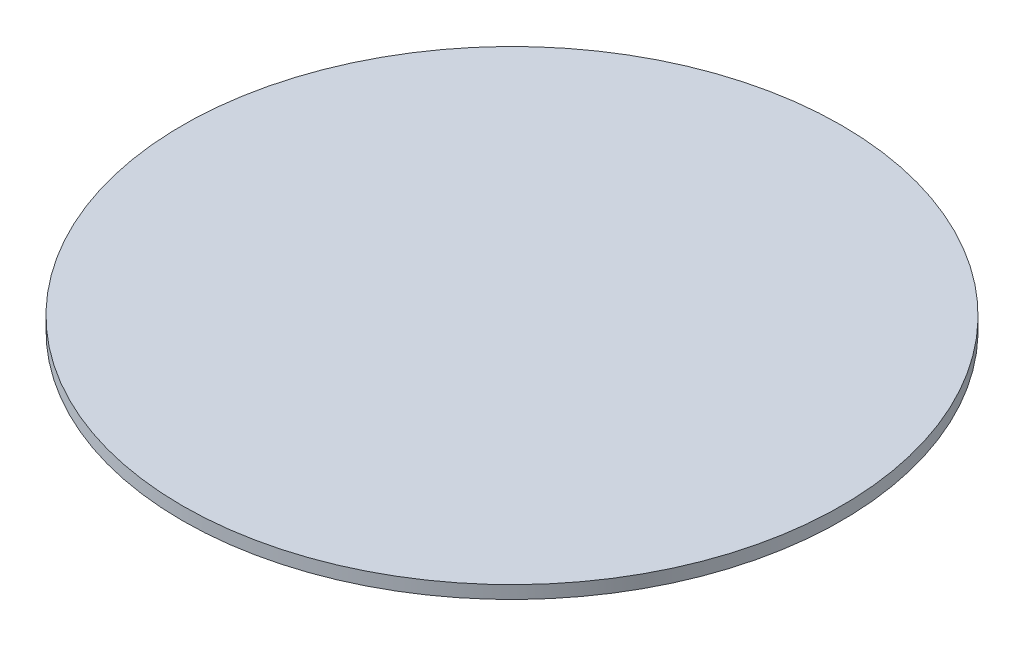
ISO-10303-21;
HEADER;
FILE_DESCRIPTION(('STEP AP214'),'2;1');
FILE_NAME('part.step','',(''),(''),'','','');
FILE_SCHEMA(('AUTOMOTIVE_DESIGN { 1 0 10303 214 1 1 1 1 }'));
ENDSEC;
DATA;
#1=APPLICATION_CONTEXT('core data for automotive mechanical design processes');
#2=APPLICATION_PROTOCOL_DEFINITION('international standard','automotive_design',2000,#1);
#3=PRODUCT_CONTEXT('',#1,'mechanical');
#4=PRODUCT('Part','Part','',(#3));
#5=PRODUCT_RELATED_PRODUCT_CATEGORY('part','',(#4));
#6=PRODUCT_DEFINITION_FORMATION('','',#4);
#7=PRODUCT_DEFINITION_CONTEXT('part definition',#1,'design');
#8=PRODUCT_DEFINITION('design','',#6,#7);
#9=PRODUCT_DEFINITION_SHAPE('','',#8);
#10=(LENGTH_UNIT() NAMED_UNIT(*) SI_UNIT(.MILLI.,.METRE.));
#11=(NAMED_UNIT(*) PLANE_ANGLE_UNIT() SI_UNIT($,.RADIAN.));
#12=(NAMED_UNIT(*) SI_UNIT($,.STERADIAN.) SOLID_ANGLE_UNIT());
#13=UNCERTAINTY_MEASURE_WITH_UNIT(LENGTH_MEASURE(1.E-05),#10,'distance_accuracy_value','');
#14=(GEOMETRIC_REPRESENTATION_CONTEXT(3) GLOBAL_UNCERTAINTY_ASSIGNED_CONTEXT((#13)) GLOBAL_UNIT_ASSIGNED_CONTEXT((#10,
#11,#12)) REPRESENTATION_CONTEXT('',''));
#15=CARTESIAN_POINT('',(0.,0.,0.));
#16=DIRECTION('',(0.,0.,1.));
#17=DIRECTION('',(1.,0.,0.));
#18=AXIS2_PLACEMENT_3D('',#15,#16,#17);
#19=CARTESIAN_POINT('',(0.,1.,0.));
#20=DIRECTION('',(0.,-1.,0.));
#21=DIRECTION('',(0.,0.,-1.));
#22=AXIS2_PLACEMENT_3D('',#19,#20,#21);
#23=CYLINDRICAL_SURFACE('',#22,25.5760854610109);
#24=CARTESIAN_POINT('',(0.,1.,0.));
#25=DIRECTION('',(0.,1.,0.));
#26=DIRECTION('',(0.,0.,1.));
#27=AXIS2_PLACEMENT_3D('',#24,#25,#26);
#28=CIRCLE('',#27,25.5760854610109);
#29=CARTESIAN_POINT('',(0.,1.,25.5760854610109));
#30=VERTEX_POINT('',#29);
#31=EDGE_CURVE('E10',#30,#30,#28,.T.);
#32=ORIENTED_EDGE('',*,*,#31,.F.);
#33=EDGE_LOOP('',(#32));
#34=FACE_BOUND('',#33,.T.);
#35=CARTESIAN_POINT('',(0.,0.,0.));
#36=DIRECTION('',(0.,1.,0.));
#37=DIRECTION('',(0.,0.,1.));
#38=AXIS2_PLACEMENT_3D('',#35,#36,#37);
#39=CIRCLE('',#38,25.5760854610109);
#40=CARTESIAN_POINT('',(0.,0.,25.5760854610109));
#41=VERTEX_POINT('',#40);
#42=EDGE_CURVE('E33',#41,#41,#39,.T.);
#43=ORIENTED_EDGE('',*,*,#42,.T.);
#44=EDGE_LOOP('',(#43));
#45=FACE_BOUND('',#44,.T.);
#46=ADVANCED_FACE('F30',(#34,#45),#23,.T.);
#47=CARTESIAN_POINT('',(0.,1.,0.));
#48=DIRECTION('',(0.,1.,0.));
#49=DIRECTION('',(0.,0.,1.));
#50=AXIS2_PLACEMENT_3D('',#47,#48,#49);
#51=PLANE('',#50);
#52=ORIENTED_EDGE('',*,*,#31,.T.);
#53=EDGE_LOOP('',(#52));
#54=FACE_BOUND('',#53,.T.);
#55=ADVANCED_FACE('F45',(#54),#51,.T.);
#56=CARTESIAN_POINT('',(0.,0.,0.));
#57=DIRECTION('',(0.,1.,0.));
#58=DIRECTION('',(0.,0.,1.));
#59=AXIS2_PLACEMENT_3D('',#56,#57,#58);
#60=PLANE('',#59);
#61=ORIENTED_EDGE('',*,*,#42,.F.);
#62=EDGE_LOOP('',(#61));
#63=FACE_BOUND('',#62,.T.);
#64=ADVANCED_FACE('F43',(#63),#60,.F.);
#65=CLOSED_SHELL('',(#46,#55,#64));
#66=MANIFOLD_SOLID_BREP('B2',#65);
#67=ADVANCED_BREP_SHAPE_REPRESENTATION('',(#18,#66),#14);
#68=SHAPE_DEFINITION_REPRESENTATION(#9,#67);
ENDSEC;
END-ISO-10303-21;
